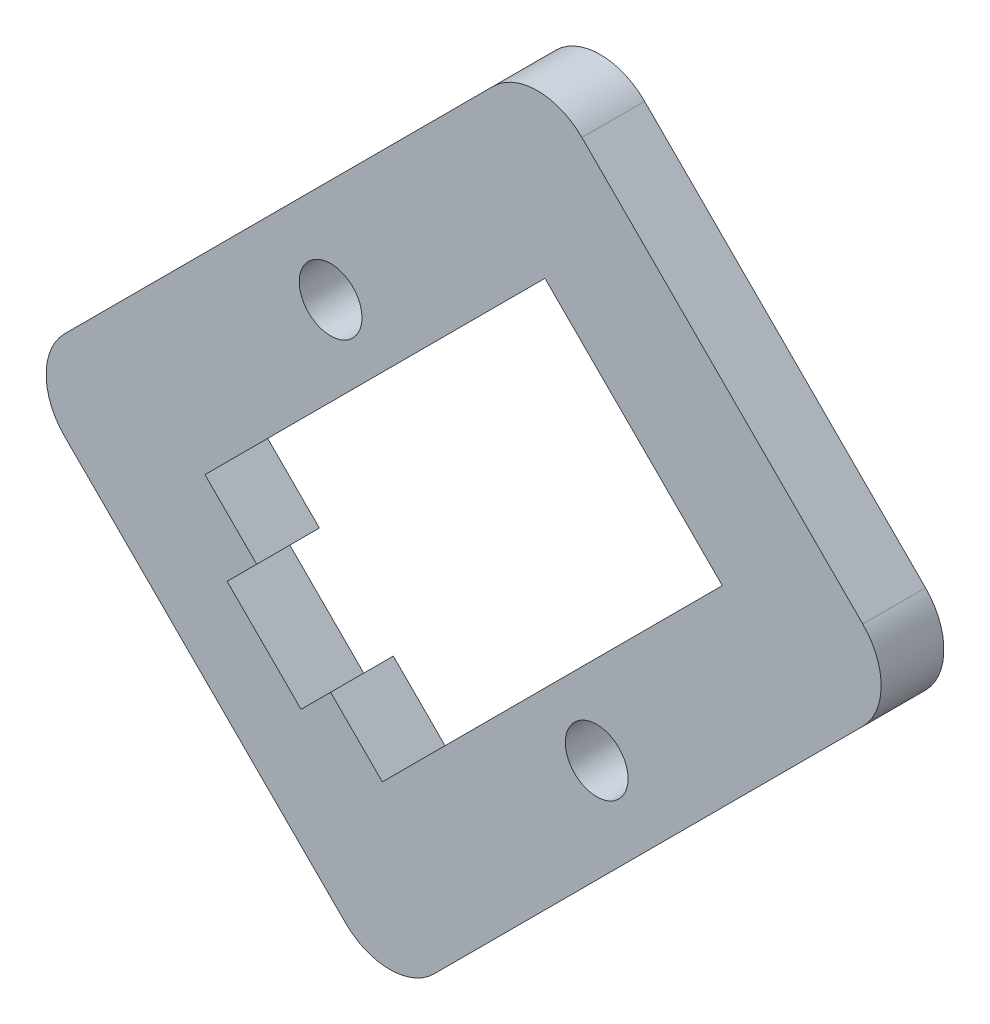
ISO-10303-21;
HEADER;
FILE_DESCRIPTION(('STEP AP214'),'2;1');
FILE_NAME('part.step','',(''),(''),'','','');
FILE_SCHEMA(('AUTOMOTIVE_DESIGN { 1 0 10303 214 1 1 1 1 }'));
ENDSEC;
DATA;
#1=APPLICATION_CONTEXT('core data for automotive mechanical design processes');
#2=APPLICATION_PROTOCOL_DEFINITION('international standard','automotive_design',2000,#1);
#3=PRODUCT_CONTEXT('',#1,'mechanical');
#4=PRODUCT('Part','Part','',(#3));
#5=PRODUCT_RELATED_PRODUCT_CATEGORY('part','',(#4));
#6=PRODUCT_DEFINITION_FORMATION('','',#4);
#7=PRODUCT_DEFINITION_CONTEXT('part definition',#1,'design');
#8=PRODUCT_DEFINITION('design','',#6,#7);
#9=PRODUCT_DEFINITION_SHAPE('','',#8);
#10=(LENGTH_UNIT() NAMED_UNIT(*) SI_UNIT(.MILLI.,.METRE.));
#11=(NAMED_UNIT(*) PLANE_ANGLE_UNIT() SI_UNIT($,.RADIAN.));
#12=(NAMED_UNIT(*) SI_UNIT($,.STERADIAN.) SOLID_ANGLE_UNIT());
#13=UNCERTAINTY_MEASURE_WITH_UNIT(LENGTH_MEASURE(1.E-05),#10,'distance_accuracy_value','');
#14=(GEOMETRIC_REPRESENTATION_CONTEXT(3) GLOBAL_UNCERTAINTY_ASSIGNED_CONTEXT((#13)) GLOBAL_UNIT_ASSIGNED_CONTEXT((#10,
#11,#12)) REPRESENTATION_CONTEXT('',''));
#15=CARTESIAN_POINT('',(0.,0.,0.));
#16=DIRECTION('',(0.,0.,1.));
#17=DIRECTION('',(1.,0.,0.));
#18=AXIS2_PLACEMENT_3D('',#15,#16,#17);
#19=CARTESIAN_POINT('',(95.6503,9.35173045402669,3.));
#20=DIRECTION('',(0.,0.,1.));
#21=DIRECTION('',(1.,0.,0.));
#22=AXIS2_PLACEMENT_3D('',#19,#20,#21);
#23=PLANE('',#22);
#24=CARTESIAN_POINT('',(105.549794938969,19.9583321718249,3.));
#25=DIRECTION('',(0.,0.,1.));
#26=DIRECTION('',(1.,0.,0.));
#27=AXIS2_PLACEMENT_3D('',#24,#25,#26);
#28=CIRCLE('',#27,1.5000000016666);
#29=CARTESIAN_POINT('',(107.049794940635,19.9583321718249,3.));
#30=VERTEX_POINT('',#29);
#31=EDGE_CURVE('E217',#30,#30,#28,.T.);
#32=ORIENTED_EDGE('',*,*,#31,.F.);
#33=EDGE_LOOP('',(#32));
#34=FACE_BOUND('',#33,.T.);
#35=CARTESIAN_POINT('',(95.6503,9.35173045402669,3.));
#36=DIRECTION('',(0.,0.,1.));
#37=DIRECTION('',(1.,0.,0.));
#38=AXIS2_PLACEMENT_3D('',#35,#36,#37);
#39=CIRCLE('',#38,3.00000000000009);
#40=CARTESIAN_POINT('',(93.5289796564403,7.23041011046696,3.));
#41=VERTEX_POINT('',#40);
#42=CARTESIAN_POINT('',(97.7716203435598,7.23041011046705,3.));
#43=VERTEX_POINT('',#42);
#44=EDGE_CURVE('E223',#41,#43,#39,.T.);
#45=ORIENTED_EDGE('',*,*,#44,.T.);
#46=DIRECTION('',(0.70710678118655,0.707106781186545,0.));
#47=VECTOR('',#46,1.);
#48=CARTESIAN_POINT('',(97.7716203435598,7.23041011046705,3.));
#49=LINE('',#48,#47);
#50=CARTESIAN_POINT('',(118.27771699797,27.7365067648768,3.));
#51=VERTEX_POINT('',#50);
#52=EDGE_CURVE('E226',#43,#51,#49,.T.);
#53=ORIENTED_EDGE('',*,*,#52,.T.);
#54=CARTESIAN_POINT('',(116.15639665441,29.8578271084365,3.));
#55=DIRECTION('',(0.,0.,1.));
#56=DIRECTION('',(1.,0.,0.));
#57=AXIS2_PLACEMENT_3D('',#54,#55,#56);
#58=CIRCLE('',#57,3.00000000000007);
#59=CARTESIAN_POINT('',(118.27771699797,31.9791474519964,3.));
#60=VERTEX_POINT('',#59);
#61=EDGE_CURVE('E229',#51,#60,#58,.T.);
#62=ORIENTED_EDGE('',*,*,#61,.T.);
#63=DIRECTION('',(-0.707106781186548,0.707106781186547,0.));
#64=VECTOR('',#63,1.);
#65=CARTESIAN_POINT('',(104.842688155425,45.4141762945406,3.));
#66=LINE('',#65,#64);
#67=CARTESIAN_POINT('',(104.842688155425,45.4141762945406,3.));
#68=VERTEX_POINT('',#67);
#69=EDGE_CURVE('E231',#60,#68,#66,.T.);
#70=ORIENTED_EDGE('',*,*,#69,.T.);
#71=CARTESIAN_POINT('',(102.721367811866,43.2928559509809,3.));
#72=DIRECTION('',(0.,0.,1.));
#73=DIRECTION('',(1.,0.,0.));
#74=AXIS2_PLACEMENT_3D('',#71,#72,#73);
#75=CIRCLE('',#74,3.00000000000001);
#76=CARTESIAN_POINT('',(100.600047468306,45.4141762945406,3.));
#77=VERTEX_POINT('',#76);
#78=EDGE_CURVE('E233',#68,#77,#75,.T.);
#79=ORIENTED_EDGE('',*,*,#78,.T.);
#80=DIRECTION('',(-0.707106781186549,-0.707106781186546,0.));
#81=VECTOR('',#80,1.);
#82=CARTESIAN_POINT('',(80.093950813896,24.9080796401307,3.));
#83=LINE('',#82,#81);
#84=CARTESIAN_POINT('',(80.093950813896,24.9080796401307,3.));
#85=VERTEX_POINT('',#84);
#86=EDGE_CURVE('E235',#77,#85,#83,.T.);
#87=ORIENTED_EDGE('',*,*,#86,.T.);
#88=CARTESIAN_POINT('',(82.2152711574557,22.7867592965711,3.));
#89=DIRECTION('',(0.,0.,1.));
#90=DIRECTION('',(1.,0.,0.));
#91=AXIS2_PLACEMENT_3D('',#88,#89,#90);
#92=CIRCLE('',#91,3.00000000000007);
#93=CARTESIAN_POINT('',(80.0939508138961,20.6654389530114,3.));
#94=VERTEX_POINT('',#93);
#95=EDGE_CURVE('E237',#85,#94,#92,.T.);
#96=ORIENTED_EDGE('',*,*,#95,.T.);
#97=DIRECTION('',(0.707106781186542,-0.707106781186553,0.));
#98=VECTOR('',#97,1.);
#99=CARTESIAN_POINT('',(80.0939508138961,20.6654389530114,3.));
#100=LINE('',#99,#98);
#101=EDGE_CURVE('E239',#94,#41,#100,.T.);
#102=ORIENTED_EDGE('',*,*,#101,.T.);
#103=EDGE_LOOP('',(#45,#53,#62,#70,#79,#87,#96,#102));
#104=FACE_BOUND('',#103,.T.);
#105=CARTESIAN_POINT('',(92.8218728776109,32.6862542331827,3.));
#106=DIRECTION('',(0.,0.,1.));
#107=DIRECTION('',(1.,0.,0.));
#108=AXIS2_PLACEMENT_3D('',#105,#106,#107);
#109=CIRCLE('',#108,1.50000000166661);
#110=CARTESIAN_POINT('',(94.3218728792775,32.6862542331827,3.));
#111=VERTEX_POINT('',#110);
#112=EDGE_CURVE('E211',#111,#111,#109,.T.);
#113=ORIENTED_EDGE('',*,*,#112,.F.);
#114=EDGE_LOOP('',(#113));
#115=FACE_BOUND('',#114,.T.);
#116=DIRECTION('',(0.70710678118656,0.707106781186535,0.));
#117=VECTOR('',#116,1.);
#118=CARTESIAN_POINT('',(91.4075886022027,15.0085139928409,3.));
#119=LINE('',#118,#117);
#120=CARTESIAN_POINT('',(91.4075886022027,15.0085139928409,3.));
#121=VERTEX_POINT('',#120);
#122=CARTESIAN_POINT('',(92.821872875254,16.4227982658921,3.));
#123=VERTEX_POINT('',#122);
#124=EDGE_CURVE('E154',#121,#123,#119,.T.);
#125=ORIENTED_EDGE('',*,*,#124,.F.);
#126=DIRECTION('',(0.707106781186542,-0.707106781186553,0.));
#127=VECTOR('',#126,1.);
#128=CARTESIAN_POINT('',(87.87205469627,18.5440478987736,3.));
#129=LINE('',#128,#127);
#130=CARTESIAN_POINT('',(87.87205469627,18.5440478987736,3.));
#131=VERTEX_POINT('',#130);
#132=EDGE_CURVE('E146',#131,#121,#129,.T.);
#133=ORIENTED_EDGE('',*,*,#132,.F.);
#134=DIRECTION('',(-0.707106781186555,-0.70710678118654,0.));
#135=VECTOR('',#134,1.);
#136=CARTESIAN_POINT('',(89.2863389693212,19.9583321718248,3.));
#137=LINE('',#136,#135);
#138=CARTESIAN_POINT('',(89.2863389693212,19.9583321718248,3.));
#139=VERTEX_POINT('',#138);
#140=EDGE_CURVE('E179',#139,#131,#137,.T.);
#141=ORIENTED_EDGE('',*,*,#140,.F.);
#142=DIRECTION('',(0.707106781186547,-0.707106781186548,0.));
#143=VECTOR('',#142,1.);
#144=CARTESIAN_POINT('',(86.8114652351683,22.4332059059778,3.));
#145=LINE('',#144,#143);
#146=CARTESIAN_POINT('',(86.8114652351683,22.4332059059778,3.));
#147=VERTEX_POINT('',#146);
#148=EDGE_CURVE('E177',#147,#139,#145,.T.);
#149=ORIENTED_EDGE('',*,*,#148,.F.);
#150=DIRECTION('',(-0.707106781186549,-0.707106781186546,0.));
#151=VECTOR('',#150,1.);
#152=CARTESIAN_POINT('',(103.074921202459,38.6966618732684,3.));
#153=LINE('',#152,#151);
#154=CARTESIAN_POINT('',(103.074921202459,38.6966618732684,3.));
#155=VERTEX_POINT('',#154);
#156=EDGE_CURVE('E175',#155,#147,#153,.T.);
#157=ORIENTED_EDGE('',*,*,#156,.F.);
#158=DIRECTION('',(-0.70710678118654,0.707106781186555,0.));
#159=VECTOR('',#158,1.);
#160=CARTESIAN_POINT('',(111.560202576697,30.2113804990299,3.));
#161=LINE('',#160,#159);
#162=CARTESIAN_POINT('',(111.560202576697,30.2113804990299,3.));
#163=VERTEX_POINT('',#162);
#164=EDGE_CURVE('E173',#163,#155,#161,.T.);
#165=ORIENTED_EDGE('',*,*,#164,.F.);
#166=DIRECTION('',(0.707106781186544,0.707106781186551,0.));
#167=VECTOR('',#166,1.);
#168=CARTESIAN_POINT('',(95.2967466094069,13.9479245317392,3.));
#169=LINE('',#168,#167);
#170=CARTESIAN_POINT('',(95.2967466094069,13.9479245317392,3.));
#171=VERTEX_POINT('',#170);
#172=EDGE_CURVE('E169',#171,#163,#169,.T.);
#173=ORIENTED_EDGE('',*,*,#172,.F.);
#174=DIRECTION('',(0.707106781186551,-0.707106781186544,0.));
#175=VECTOR('',#174,1.);
#176=CARTESIAN_POINT('',(92.821872875254,16.4227982658921,3.));
#177=LINE('',#176,#175);
#178=EDGE_CURVE('E167',#123,#171,#177,.T.);
#179=ORIENTED_EDGE('',*,*,#178,.F.);
#180=EDGE_LOOP('',(#125,#133,#141,#149,#157,#165,#173,#179));
#181=FACE_BOUND('',#180,.T.);
#182=ADVANCED_FACE('F33',(#34,#104,#115,#181),#23,.T.);
#183=CARTESIAN_POINT('',(95.6503,9.35173045402669,0.));
#184=DIRECTION('',(0.,0.,1.));
#185=DIRECTION('',(1.,0.,0.));
#186=AXIS2_PLACEMENT_3D('',#183,#184,#185);
#187=PLANE('',#186);
#188=CARTESIAN_POINT('',(92.8218728776109,32.6862542331827,0.));
#189=DIRECTION('',(0.,0.,1.));
#190=DIRECTION('',(1.,0.,0.));
#191=AXIS2_PLACEMENT_3D('',#188,#189,#190);
#192=CIRCLE('',#191,1.50000000166661);
#193=CARTESIAN_POINT('',(94.3218728792775,32.6862542331827,0.));
#194=VERTEX_POINT('',#193);
#195=EDGE_CURVE('E162',#194,#194,#192,.T.);
#196=ORIENTED_EDGE('',*,*,#195,.T.);
#197=EDGE_LOOP('',(#196));
#198=FACE_BOUND('',#197,.T.);
#199=CARTESIAN_POINT('',(105.549794938969,19.9583321718249,0.));
#200=DIRECTION('',(0.,0.,1.));
#201=DIRECTION('',(1.,0.,0.));
#202=AXIS2_PLACEMENT_3D('',#199,#200,#201);
#203=CIRCLE('',#202,1.5000000016666);
#204=CARTESIAN_POINT('',(107.049794940635,19.9583321718249,0.));
#205=VERTEX_POINT('',#204);
#206=EDGE_CURVE('E214',#205,#205,#203,.T.);
#207=ORIENTED_EDGE('',*,*,#206,.T.);
#208=EDGE_LOOP('',(#207));
#209=FACE_BOUND('',#208,.T.);
#210=CARTESIAN_POINT('',(95.6503,9.35173045402669,0.));
#211=DIRECTION('',(0.,0.,1.));
#212=DIRECTION('',(1.,0.,0.));
#213=AXIS2_PLACEMENT_3D('',#210,#211,#212);
#214=CIRCLE('',#213,3.00000000000009);
#215=CARTESIAN_POINT('',(93.5289796564403,7.23041011046696,0.));
#216=VERTEX_POINT('',#215);
#217=CARTESIAN_POINT('',(97.7716203435598,7.23041011046705,0.));
#218=VERTEX_POINT('',#217);
#219=EDGE_CURVE('E220',#216,#218,#214,.T.);
#220=ORIENTED_EDGE('',*,*,#219,.F.);
#221=DIRECTION('',(0.707106781186542,-0.707106781186553,0.));
#222=VECTOR('',#221,1.);
#223=CARTESIAN_POINT('',(80.0939508138961,20.6654389530114,0.));
#224=LINE('',#223,#222);
#225=CARTESIAN_POINT('',(80.0939508138961,20.6654389530114,0.));
#226=VERTEX_POINT('',#225);
#227=EDGE_CURVE('E227',#226,#216,#224,.T.);
#228=ORIENTED_EDGE('',*,*,#227,.F.);
#229=CARTESIAN_POINT('',(82.2152711574557,22.7867592965711,0.));
#230=DIRECTION('',(0.,0.,1.));
#231=DIRECTION('',(1.,0.,0.));
#232=AXIS2_PLACEMENT_3D('',#229,#230,#231);
#233=CIRCLE('',#232,3.00000000000007);
#234=CARTESIAN_POINT('',(80.093950813896,24.9080796401307,0.));
#235=VERTEX_POINT('',#234);
#236=EDGE_CURVE('E254',#235,#226,#233,.T.);
#237=ORIENTED_EDGE('',*,*,#236,.F.);
#238=DIRECTION('',(-0.707106781186549,-0.707106781186546,0.));
#239=VECTOR('',#238,1.);
#240=CARTESIAN_POINT('',(80.093950813896,24.9080796401307,0.));
#241=LINE('',#240,#239);
#242=CARTESIAN_POINT('',(100.600047468306,45.4141762945406,0.));
#243=VERTEX_POINT('',#242);
#244=EDGE_CURVE('E252',#243,#235,#241,.T.);
#245=ORIENTED_EDGE('',*,*,#244,.F.);
#246=CARTESIAN_POINT('',(102.721367811866,43.2928559509809,0.));
#247=DIRECTION('',(0.,0.,1.));
#248=DIRECTION('',(1.,0.,0.));
#249=AXIS2_PLACEMENT_3D('',#246,#247,#248);
#250=CIRCLE('',#249,3.00000000000001);
#251=CARTESIAN_POINT('',(104.842688155425,45.4141762945406,0.));
#252=VERTEX_POINT('',#251);
#253=EDGE_CURVE('E250',#252,#243,#250,.T.);
#254=ORIENTED_EDGE('',*,*,#253,.F.);
#255=DIRECTION('',(-0.707106781186548,0.707106781186547,0.));
#256=VECTOR('',#255,1.);
#257=CARTESIAN_POINT('',(104.842688155425,45.4141762945406,0.));
#258=LINE('',#257,#256);
#259=CARTESIAN_POINT('',(118.27771699797,31.9791474519964,0.));
#260=VERTEX_POINT('',#259);
#261=EDGE_CURVE('E248',#260,#252,#258,.T.);
#262=ORIENTED_EDGE('',*,*,#261,.F.);
#263=CARTESIAN_POINT('',(116.15639665441,29.8578271084365,0.));
#264=DIRECTION('',(0.,0.,1.));
#265=DIRECTION('',(1.,0.,0.));
#266=AXIS2_PLACEMENT_3D('',#263,#264,#265);
#267=CIRCLE('',#266,3.00000000000007);
#268=CARTESIAN_POINT('',(118.27771699797,27.7365067648768,0.));
#269=VERTEX_POINT('',#268);
#270=EDGE_CURVE('E246',#269,#260,#267,.T.);
#271=ORIENTED_EDGE('',*,*,#270,.F.);
#272=DIRECTION('',(0.70710678118655,0.707106781186545,0.));
#273=VECTOR('',#272,1.);
#274=CARTESIAN_POINT('',(97.7716203435598,7.23041011046705,0.));
#275=LINE('',#274,#273);
#276=EDGE_CURVE('E244',#218,#269,#275,.T.);
#277=ORIENTED_EDGE('',*,*,#276,.F.);
#278=EDGE_LOOP('',(#220,#228,#237,#245,#254,#262,#271,#277));
#279=FACE_BOUND('',#278,.T.);
#280=DIRECTION('',(0.707106781186542,-0.707106781186553,0.));
#281=VECTOR('',#280,1.);
#282=CARTESIAN_POINT('',(87.87205469627,18.5440478987736,0.));
#283=LINE('',#282,#281);
#284=CARTESIAN_POINT('',(87.87205469627,18.5440478987736,0.));
#285=VERTEX_POINT('',#284);
#286=CARTESIAN_POINT('',(91.4075886022027,15.0085139928409,0.));
#287=VERTEX_POINT('',#286);
#288=EDGE_CURVE('E56',#285,#287,#283,.T.);
#289=ORIENTED_EDGE('',*,*,#288,.T.);
#290=DIRECTION('',(0.70710678118656,0.707106781186535,0.));
#291=VECTOR('',#290,1.);
#292=CARTESIAN_POINT('',(91.4075886022027,15.0085139928409,0.));
#293=LINE('',#292,#291);
#294=CARTESIAN_POINT('',(92.821872875254,16.4227982658921,0.));
#295=VERTEX_POINT('',#294);
#296=EDGE_CURVE('E161',#287,#295,#293,.T.);
#297=ORIENTED_EDGE('',*,*,#296,.T.);
#298=DIRECTION('',(0.707106781186551,-0.707106781186544,0.));
#299=VECTOR('',#298,1.);
#300=CARTESIAN_POINT('',(92.821872875254,16.4227982658921,0.));
#301=LINE('',#300,#299);
#302=CARTESIAN_POINT('',(95.2967466094069,13.9479245317392,0.));
#303=VERTEX_POINT('',#302);
#304=EDGE_CURVE('E183',#295,#303,#301,.T.);
#305=ORIENTED_EDGE('',*,*,#304,.T.);
#306=DIRECTION('',(0.707106781186544,0.707106781186551,0.));
#307=VECTOR('',#306,1.);
#308=CARTESIAN_POINT('',(95.2967466094069,13.9479245317392,0.));
#309=LINE('',#308,#307);
#310=CARTESIAN_POINT('',(111.560202576697,30.2113804990299,0.));
#311=VERTEX_POINT('',#310);
#312=EDGE_CURVE('E186',#303,#311,#309,.T.);
#313=ORIENTED_EDGE('',*,*,#312,.T.);
#314=DIRECTION('',(-0.70710678118654,0.707106781186555,0.));
#315=VECTOR('',#314,1.);
#316=CARTESIAN_POINT('',(111.560202576697,30.2113804990299,0.));
#317=LINE('',#316,#315);
#318=CARTESIAN_POINT('',(103.074921202459,38.6966618732684,0.));
#319=VERTEX_POINT('',#318);
#320=EDGE_CURVE('E189',#311,#319,#317,.T.);
#321=ORIENTED_EDGE('',*,*,#320,.T.);
#322=DIRECTION('',(-0.707106781186549,-0.707106781186546,0.));
#323=VECTOR('',#322,1.);
#324=CARTESIAN_POINT('',(103.074921202459,38.6966618732684,0.));
#325=LINE('',#324,#323);
#326=CARTESIAN_POINT('',(86.8114652351683,22.4332059059778,0.));
#327=VERTEX_POINT('',#326);
#328=EDGE_CURVE('E192',#319,#327,#325,.T.);
#329=ORIENTED_EDGE('',*,*,#328,.T.);
#330=DIRECTION('',(0.707106781186547,-0.707106781186548,0.));
#331=VECTOR('',#330,1.);
#332=CARTESIAN_POINT('',(86.8114652351683,22.4332059059778,0.));
#333=LINE('',#332,#331);
#334=CARTESIAN_POINT('',(89.2863389693212,19.9583321718248,0.));
#335=VERTEX_POINT('',#334);
#336=EDGE_CURVE('E195',#327,#335,#333,.T.);
#337=ORIENTED_EDGE('',*,*,#336,.T.);
#338=DIRECTION('',(-0.707106781186555,-0.70710678118654,0.));
#339=VECTOR('',#338,1.);
#340=CARTESIAN_POINT('',(89.2863389693212,19.9583321718248,0.));
#341=LINE('',#340,#339);
#342=EDGE_CURVE('E155',#335,#285,#341,.T.);
#343=ORIENTED_EDGE('',*,*,#342,.T.);
#344=EDGE_LOOP('',(#289,#297,#305,#313,#321,#329,#337,#343));
#345=FACE_BOUND('',#344,.T.);
#346=ADVANCED_FACE('F284',(#198,#209,#279,#345),#187,.F.);
#347=CARTESIAN_POINT('',(95.6503,9.35173045402669,3.));
#348=DIRECTION('',(0.,0.,-1.));
#349=DIRECTION('',(-1.,0.,0.));
#350=AXIS2_PLACEMENT_3D('',#347,#348,#349);
#351=CYLINDRICAL_SURFACE('',#350,3.00000000000009);
#352=ORIENTED_EDGE('',*,*,#219,.T.);
#353=DIRECTION('',(0.,0.,-1.));
#354=VECTOR('',#353,1.);
#355=CARTESIAN_POINT('',(97.7716203435598,7.23041011046705,3.));
#356=LINE('',#355,#354);
#357=EDGE_CURVE('E11',#43,#218,#356,.T.);
#358=ORIENTED_EDGE('',*,*,#357,.F.);
#359=ORIENTED_EDGE('',*,*,#44,.F.);
#360=DIRECTION('',(0.,0.,-1.));
#361=VECTOR('',#360,1.);
#362=CARTESIAN_POINT('',(93.5289796564403,7.23041011046696,3.));
#363=LINE('',#362,#361);
#364=EDGE_CURVE('E241',#41,#216,#363,.T.);
#365=ORIENTED_EDGE('',*,*,#364,.T.);
#366=EDGE_LOOP('',(#352,#358,#359,#365));
#367=FACE_BOUND('',#366,.T.);
#368=ADVANCED_FACE('F35',(#367),#351,.T.);
#369=CARTESIAN_POINT('',(97.7716203435598,7.23041011046705,3.));
#370=DIRECTION('',(-0.707106781186545,0.70710678118655,0.));
#371=DIRECTION('',(-0.70710678118655,-0.707106781186545,0.));
#372=AXIS2_PLACEMENT_3D('',#369,#370,#371);
#373=PLANE('',#372);
#374=ORIENTED_EDGE('',*,*,#276,.T.);
#375=DIRECTION('',(0.,0.,-1.));
#376=VECTOR('',#375,1.);
#377=CARTESIAN_POINT('',(118.27771699797,27.7365067648768,3.));
#378=LINE('',#377,#376);
#379=EDGE_CURVE('E41',#51,#269,#378,.T.);
#380=ORIENTED_EDGE('',*,*,#379,.F.);
#381=ORIENTED_EDGE('',*,*,#52,.F.);
#382=ORIENTED_EDGE('',*,*,#357,.T.);
#383=EDGE_LOOP('',(#374,#380,#381,#382));
#384=FACE_BOUND('',#383,.T.);
#385=ADVANCED_FACE('F302',(#384),#373,.F.);
#386=CARTESIAN_POINT('',(116.15639665441,29.8578271084365,3.));
#387=DIRECTION('',(0.,0.,-1.));
#388=DIRECTION('',(-1.,0.,0.));
#389=AXIS2_PLACEMENT_3D('',#386,#387,#388);
#390=CYLINDRICAL_SURFACE('',#389,3.00000000000007);
#391=ORIENTED_EDGE('',*,*,#270,.T.);
#392=DIRECTION('',(0.,0.,-1.));
#393=VECTOR('',#392,1.);
#394=CARTESIAN_POINT('',(118.27771699797,31.9791474519964,3.));
#395=LINE('',#394,#393);
#396=EDGE_CURVE('E271',#60,#260,#395,.T.);
#397=ORIENTED_EDGE('',*,*,#396,.F.);
#398=ORIENTED_EDGE('',*,*,#61,.F.);
#399=ORIENTED_EDGE('',*,*,#379,.T.);
#400=EDGE_LOOP('',(#391,#397,#398,#399));
#401=FACE_BOUND('',#400,.T.);
#402=ADVANCED_FACE('F278',(#401),#390,.T.);
#403=CARTESIAN_POINT('',(104.842688155425,45.4141762945406,3.));
#404=DIRECTION('',(-0.707106781186547,-0.707106781186548,0.));
#405=DIRECTION('',(0.707106781186548,-0.707106781186547,0.));
#406=AXIS2_PLACEMENT_3D('',#403,#404,#405);
#407=PLANE('',#406);
#408=ORIENTED_EDGE('',*,*,#261,.T.);
#409=DIRECTION('',(0.,0.,-1.));
#410=VECTOR('',#409,1.);
#411=CARTESIAN_POINT('',(104.842688155425,45.4141762945406,3.));
#412=LINE('',#411,#410);
#413=EDGE_CURVE('E268',#68,#252,#412,.T.);
#414=ORIENTED_EDGE('',*,*,#413,.F.);
#415=ORIENTED_EDGE('',*,*,#69,.F.);
#416=ORIENTED_EDGE('',*,*,#396,.T.);
#417=EDGE_LOOP('',(#408,#414,#415,#416));
#418=FACE_BOUND('',#417,.T.);
#419=ADVANCED_FACE('F290',(#418),#407,.F.);
#420=CARTESIAN_POINT('',(102.721367811866,43.2928559509809,3.));
#421=DIRECTION('',(0.,0.,-1.));
#422=DIRECTION('',(-1.,0.,0.));
#423=AXIS2_PLACEMENT_3D('',#420,#421,#422);
#424=CYLINDRICAL_SURFACE('',#423,3.00000000000001);
#425=ORIENTED_EDGE('',*,*,#253,.T.);
#426=DIRECTION('',(0.,0.,-1.));
#427=VECTOR('',#426,1.);
#428=CARTESIAN_POINT('',(100.600047468306,45.4141762945406,3.));
#429=LINE('',#428,#427);
#430=EDGE_CURVE('E265',#77,#243,#429,.T.);
#431=ORIENTED_EDGE('',*,*,#430,.F.);
#432=ORIENTED_EDGE('',*,*,#78,.F.);
#433=ORIENTED_EDGE('',*,*,#413,.T.);
#434=EDGE_LOOP('',(#425,#431,#432,#433));
#435=FACE_BOUND('',#434,.T.);
#436=ADVANCED_FACE('F294',(#435),#424,.T.);
#437=CARTESIAN_POINT('',(80.093950813896,24.9080796401307,3.));
#438=DIRECTION('',(0.707106781186546,-0.707106781186549,0.));
#439=DIRECTION('',(0.707106781186549,0.707106781186546,0.));
#440=AXIS2_PLACEMENT_3D('',#437,#438,#439);
#441=PLANE('',#440);
#442=ORIENTED_EDGE('',*,*,#244,.T.);
#443=DIRECTION('',(0.,0.,-1.));
#444=VECTOR('',#443,1.);
#445=CARTESIAN_POINT('',(80.093950813896,24.9080796401307,3.));
#446=LINE('',#445,#444);
#447=EDGE_CURVE('E262',#85,#235,#446,.T.);
#448=ORIENTED_EDGE('',*,*,#447,.F.);
#449=ORIENTED_EDGE('',*,*,#86,.F.);
#450=ORIENTED_EDGE('',*,*,#430,.T.);
#451=EDGE_LOOP('',(#442,#448,#449,#450));
#452=FACE_BOUND('',#451,.T.);
#453=ADVANCED_FACE('F315',(#452),#441,.F.);
#454=CARTESIAN_POINT('',(82.2152711574557,22.7867592965711,3.));
#455=DIRECTION('',(0.,0.,-1.));
#456=DIRECTION('',(-1.,0.,0.));
#457=AXIS2_PLACEMENT_3D('',#454,#455,#456);
#458=CYLINDRICAL_SURFACE('',#457,3.00000000000007);
#459=ORIENTED_EDGE('',*,*,#236,.T.);
#460=DIRECTION('',(0.,0.,-1.));
#461=VECTOR('',#460,1.);
#462=CARTESIAN_POINT('',(80.0939508138961,20.6654389530114,3.));
#463=LINE('',#462,#461);
#464=EDGE_CURVE('E259',#94,#226,#463,.T.);
#465=ORIENTED_EDGE('',*,*,#464,.F.);
#466=ORIENTED_EDGE('',*,*,#95,.F.);
#467=ORIENTED_EDGE('',*,*,#447,.T.);
#468=EDGE_LOOP('',(#459,#465,#466,#467));
#469=FACE_BOUND('',#468,.T.);
#470=ADVANCED_FACE('F313',(#469),#458,.T.);
#471=CARTESIAN_POINT('',(80.0939508138961,20.6654389530114,3.));
#472=DIRECTION('',(0.707106781186553,0.707106781186542,0.));
#473=DIRECTION('',(-0.707106781186542,0.707106781186553,0.));
#474=AXIS2_PLACEMENT_3D('',#471,#472,#473);
#475=PLANE('',#474);
#476=ORIENTED_EDGE('',*,*,#227,.T.);
#477=ORIENTED_EDGE('',*,*,#364,.F.);
#478=ORIENTED_EDGE('',*,*,#101,.F.);
#479=ORIENTED_EDGE('',*,*,#464,.T.);
#480=EDGE_LOOP('',(#476,#477,#478,#479));
#481=FACE_BOUND('',#480,.T.);
#482=ADVANCED_FACE('F308',(#481),#475,.F.);
#483=CARTESIAN_POINT('',(105.549794938969,19.9583321718249,3.));
#484=DIRECTION('',(0.,0.,-1.));
#485=DIRECTION('',(-1.,0.,0.));
#486=AXIS2_PLACEMENT_3D('',#483,#484,#485);
#487=CYLINDRICAL_SURFACE('',#486,1.5000000016666);
#488=ORIENTED_EDGE('',*,*,#31,.T.);
#489=EDGE_LOOP('',(#488));
#490=FACE_BOUND('',#489,.T.);
#491=ORIENTED_EDGE('',*,*,#206,.F.);
#492=EDGE_LOOP('',(#491));
#493=FACE_BOUND('',#492,.T.);
#494=ADVANCED_FACE('F334',(#490,#493),#487,.F.);
#495=CARTESIAN_POINT('',(92.8218728776109,32.6862542331827,3.));
#496=DIRECTION('',(0.,0.,-1.));
#497=DIRECTION('',(-1.,0.,0.));
#498=AXIS2_PLACEMENT_3D('',#495,#496,#497);
#499=CYLINDRICAL_SURFACE('',#498,1.50000000166661);
#500=ORIENTED_EDGE('',*,*,#112,.T.);
#501=EDGE_LOOP('',(#500));
#502=FACE_BOUND('',#501,.T.);
#503=ORIENTED_EDGE('',*,*,#195,.F.);
#504=EDGE_LOOP('',(#503));
#505=FACE_BOUND('',#504,.T.);
#506=ADVANCED_FACE('F341',(#502,#505),#499,.F.);
#507=CARTESIAN_POINT('',(87.87205469627,18.5440478987736,3.));
#508=DIRECTION('',(0.707106781186553,0.707106781186542,0.));
#509=DIRECTION('',(-0.707106781186542,0.707106781186553,0.));
#510=AXIS2_PLACEMENT_3D('',#507,#508,#509);
#511=PLANE('',#510);
#512=ORIENTED_EDGE('',*,*,#288,.F.);
#513=DIRECTION('',(0.,0.,-1.));
#514=VECTOR('',#513,1.);
#515=CARTESIAN_POINT('',(87.87205469627,18.5440478987736,3.));
#516=LINE('',#515,#514);
#517=EDGE_CURVE('E150',#131,#285,#516,.T.);
#518=ORIENTED_EDGE('',*,*,#517,.F.);
#519=ORIENTED_EDGE('',*,*,#132,.T.);
#520=DIRECTION('',(0.,0.,-1.));
#521=VECTOR('',#520,1.);
#522=CARTESIAN_POINT('',(91.4075886022027,15.0085139928409,3.));
#523=LINE('',#522,#521);
#524=EDGE_CURVE('E149',#121,#287,#523,.T.);
#525=ORIENTED_EDGE('',*,*,#524,.T.);
#526=EDGE_LOOP('',(#512,#518,#519,#525));
#527=FACE_BOUND('',#526,.T.);
#528=ADVANCED_FACE('F148',(#527),#511,.T.);
#529=CARTESIAN_POINT('',(91.4075886022027,15.0085139928409,3.));
#530=DIRECTION('',(-0.707106781186535,0.70710678118656,0.));
#531=DIRECTION('',(-0.70710678118656,-0.707106781186535,0.));
#532=AXIS2_PLACEMENT_3D('',#529,#530,#531);
#533=PLANE('',#532);
#534=ORIENTED_EDGE('',*,*,#296,.F.);
#535=ORIENTED_EDGE('',*,*,#524,.F.);
#536=ORIENTED_EDGE('',*,*,#124,.T.);
#537=DIRECTION('',(0.,0.,-1.));
#538=VECTOR('',#537,1.);
#539=CARTESIAN_POINT('',(92.821872875254,16.4227982658921,3.));
#540=LINE('',#539,#538);
#541=EDGE_CURVE('E163',#123,#295,#540,.T.);
#542=ORIENTED_EDGE('',*,*,#541,.T.);
#543=EDGE_LOOP('',(#534,#535,#536,#542));
#544=FACE_BOUND('',#543,.T.);
#545=ADVANCED_FACE('F158',(#544),#533,.T.);
#546=CARTESIAN_POINT('',(92.821872875254,16.4227982658921,3.));
#547=DIRECTION('',(0.707106781186544,0.707106781186551,0.));
#548=DIRECTION('',(-0.707106781186551,0.707106781186544,0.));
#549=AXIS2_PLACEMENT_3D('',#546,#547,#548);
#550=PLANE('',#549);
#551=ORIENTED_EDGE('',*,*,#304,.F.);
#552=ORIENTED_EDGE('',*,*,#541,.F.);
#553=ORIENTED_EDGE('',*,*,#178,.T.);
#554=DIRECTION('',(0.,0.,-1.));
#555=VECTOR('',#554,1.);
#556=CARTESIAN_POINT('',(95.2967466094069,13.9479245317392,3.));
#557=LINE('',#556,#555);
#558=EDGE_CURVE('E208',#171,#303,#557,.T.);
#559=ORIENTED_EDGE('',*,*,#558,.T.);
#560=EDGE_LOOP('',(#551,#552,#553,#559));
#561=FACE_BOUND('',#560,.T.);
#562=ADVANCED_FACE('F358',(#561),#550,.T.);
#563=CARTESIAN_POINT('',(95.2967466094069,13.9479245317392,3.));
#564=DIRECTION('',(-0.707106781186551,0.707106781186544,0.));
#565=DIRECTION('',(-0.707106781186544,-0.707106781186551,0.));
#566=AXIS2_PLACEMENT_3D('',#563,#564,#565);
#567=PLANE('',#566);
#568=ORIENTED_EDGE('',*,*,#312,.F.);
#569=ORIENTED_EDGE('',*,*,#558,.F.);
#570=ORIENTED_EDGE('',*,*,#172,.T.);
#571=DIRECTION('',(0.,0.,-1.));
#572=VECTOR('',#571,1.);
#573=CARTESIAN_POINT('',(111.560202576697,30.2113804990299,3.));
#574=LINE('',#573,#572);
#575=EDGE_CURVE('E206',#163,#311,#574,.T.);
#576=ORIENTED_EDGE('',*,*,#575,.T.);
#577=EDGE_LOOP('',(#568,#569,#570,#576));
#578=FACE_BOUND('',#577,.T.);
#579=ADVANCED_FACE('F361',(#578),#567,.T.);
#580=CARTESIAN_POINT('',(111.560202576697,30.2113804990299,3.));
#581=DIRECTION('',(-0.707106781186555,-0.70710678118654,0.));
#582=DIRECTION('',(0.70710678118654,-0.707106781186555,0.));
#583=AXIS2_PLACEMENT_3D('',#580,#581,#582);
#584=PLANE('',#583);
#585=ORIENTED_EDGE('',*,*,#320,.F.);
#586=ORIENTED_EDGE('',*,*,#575,.F.);
#587=ORIENTED_EDGE('',*,*,#164,.T.);
#588=DIRECTION('',(0.,0.,-1.));
#589=VECTOR('',#588,1.);
#590=CARTESIAN_POINT('',(103.074921202459,38.6966618732684,3.));
#591=LINE('',#590,#589);
#592=EDGE_CURVE('E204',#155,#319,#591,.T.);
#593=ORIENTED_EDGE('',*,*,#592,.T.);
#594=EDGE_LOOP('',(#585,#586,#587,#593));
#595=FACE_BOUND('',#594,.T.);
#596=ADVANCED_FACE('F365',(#595),#584,.T.);
#597=CARTESIAN_POINT('',(103.074921202459,38.6966618732684,3.));
#598=DIRECTION('',(0.707106781186546,-0.707106781186549,0.));
#599=DIRECTION('',(0.707106781186549,0.707106781186546,0.));
#600=AXIS2_PLACEMENT_3D('',#597,#598,#599);
#601=PLANE('',#600);
#602=ORIENTED_EDGE('',*,*,#328,.F.);
#603=ORIENTED_EDGE('',*,*,#592,.F.);
#604=ORIENTED_EDGE('',*,*,#156,.T.);
#605=DIRECTION('',(0.,0.,-1.));
#606=VECTOR('',#605,1.);
#607=CARTESIAN_POINT('',(86.8114652351683,22.4332059059778,3.));
#608=LINE('',#607,#606);
#609=EDGE_CURVE('E202',#147,#327,#608,.T.);
#610=ORIENTED_EDGE('',*,*,#609,.T.);
#611=EDGE_LOOP('',(#602,#603,#604,#610));
#612=FACE_BOUND('',#611,.T.);
#613=ADVANCED_FACE('F369',(#612),#601,.T.);
#614=CARTESIAN_POINT('',(86.8114652351683,22.4332059059778,3.));
#615=DIRECTION('',(0.707106781186548,0.707106781186547,0.));
#616=DIRECTION('',(-0.707106781186547,0.707106781186548,0.));
#617=AXIS2_PLACEMENT_3D('',#614,#615,#616);
#618=PLANE('',#617);
#619=ORIENTED_EDGE('',*,*,#336,.F.);
#620=ORIENTED_EDGE('',*,*,#609,.F.);
#621=ORIENTED_EDGE('',*,*,#148,.T.);
#622=DIRECTION('',(0.,0.,-1.));
#623=VECTOR('',#622,1.);
#624=CARTESIAN_POINT('',(89.2863389693212,19.9583321718248,3.));
#625=LINE('',#624,#623);
#626=EDGE_CURVE('E48',#139,#335,#625,.T.);
#627=ORIENTED_EDGE('',*,*,#626,.T.);
#628=EDGE_LOOP('',(#619,#620,#621,#627));
#629=FACE_BOUND('',#628,.T.);
#630=ADVANCED_FACE('F373',(#629),#618,.T.);
#631=CARTESIAN_POINT('',(89.2863389693212,19.9583321718248,3.));
#632=DIRECTION('',(0.707106781186539,-0.707106781186555,0.));
#633=DIRECTION('',(0.707106781186555,0.70710678118654,0.));
#634=AXIS2_PLACEMENT_3D('',#631,#632,#633);
#635=PLANE('',#634);
#636=ORIENTED_EDGE('',*,*,#342,.F.);
#637=ORIENTED_EDGE('',*,*,#626,.F.);
#638=ORIENTED_EDGE('',*,*,#140,.T.);
#639=ORIENTED_EDGE('',*,*,#517,.T.);
#640=EDGE_LOOP('',(#636,#637,#638,#639));
#641=FACE_BOUND('',#640,.T.);
#642=ADVANCED_FACE('F377',(#641),#635,.T.);
#643=CLOSED_SHELL('',(#182,#346,#368,#385,#402,#419,#436,#453,#470,#482,#494,#506,#528,#545,
#562,#579,#596,#613,#630,#642));
#644=MANIFOLD_SOLID_BREP('B2',#643);
#645=ADVANCED_BREP_SHAPE_REPRESENTATION('',(#18,#644),#14);
#646=SHAPE_DEFINITION_REPRESENTATION(#9,#645);
ENDSEC;
END-ISO-10303-21;
